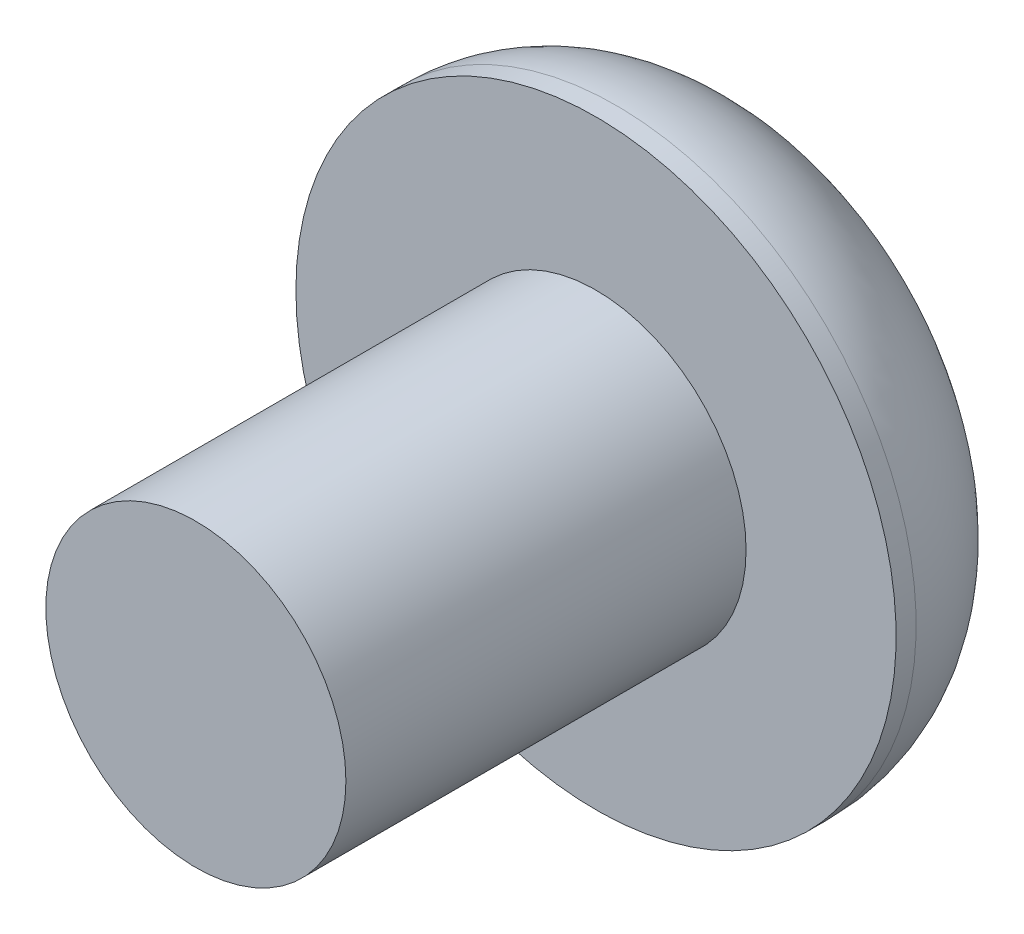
ISO-10303-21;
HEADER;
FILE_DESCRIPTION(('STEP AP214'),'2;1');
FILE_NAME('part.step','',(''),(''),'','','');
FILE_SCHEMA(('AUTOMOTIVE_DESIGN { 1 0 10303 214 1 1 1 1 }'));
ENDSEC;
DATA;
#1=APPLICATION_CONTEXT('core data for automotive mechanical design processes');
#2=APPLICATION_PROTOCOL_DEFINITION('international standard','automotive_design',2000,#1);
#3=PRODUCT_CONTEXT('',#1,'mechanical');
#4=PRODUCT('Part','Part','',(#3));
#5=PRODUCT_RELATED_PRODUCT_CATEGORY('part','',(#4));
#6=PRODUCT_DEFINITION_FORMATION('','',#4);
#7=PRODUCT_DEFINITION_CONTEXT('part definition',#1,'design');
#8=PRODUCT_DEFINITION('design','',#6,#7);
#9=PRODUCT_DEFINITION_SHAPE('','',#8);
#10=(LENGTH_UNIT() NAMED_UNIT(*) SI_UNIT(.MILLI.,.METRE.));
#11=(NAMED_UNIT(*) PLANE_ANGLE_UNIT() SI_UNIT($,.RADIAN.));
#12=(NAMED_UNIT(*) SI_UNIT($,.STERADIAN.) SOLID_ANGLE_UNIT());
#13=UNCERTAINTY_MEASURE_WITH_UNIT(LENGTH_MEASURE(1.E-05),#10,'distance_accuracy_value','');
#14=(GEOMETRIC_REPRESENTATION_CONTEXT(3) GLOBAL_UNCERTAINTY_ASSIGNED_CONTEXT((#13)) GLOBAL_UNIT_ASSIGNED_CONTEXT((#10,
#11,#12)) REPRESENTATION_CONTEXT('',''));
#15=CARTESIAN_POINT('',(0.,0.,0.));
#16=DIRECTION('',(0.,0.,1.));
#17=DIRECTION('',(1.,0.,0.));
#18=AXIS2_PLACEMENT_3D('',#15,#16,#17);
#19=CARTESIAN_POINT('',(0.,0.,4.));
#20=DIRECTION('',(0.,0.,-1.));
#21=DIRECTION('',(-1.,0.,0.));
#22=AXIS2_PLACEMENT_3D('',#19,#20,#21);
#23=CYLINDRICAL_SURFACE('',#22,1.5);
#24=CARTESIAN_POINT('',(0.,0.,4.));
#25=DIRECTION('',(0.,0.,1.));
#26=DIRECTION('',(1.,0.,0.));
#27=AXIS2_PLACEMENT_3D('',#24,#25,#26);
#28=CIRCLE('',#27,1.5);
#29=CARTESIAN_POINT('',(1.5,0.,4.));
#30=VERTEX_POINT('',#29);
#31=EDGE_CURVE('E52',#30,#30,#28,.T.);
#32=ORIENTED_EDGE('',*,*,#31,.F.);
#33=EDGE_LOOP('',(#32));
#34=FACE_BOUND('',#33,.T.);
#35=CARTESIAN_POINT('',(0.,0.,0.));
#36=DIRECTION('',(0.,0.,1.));
#37=DIRECTION('',(1.,0.,0.));
#38=AXIS2_PLACEMENT_3D('',#35,#36,#37);
#39=CIRCLE('',#38,1.5);
#40=CARTESIAN_POINT('',(1.5,0.,0.));
#41=VERTEX_POINT('',#40);
#42=EDGE_CURVE('E57',#41,#41,#39,.T.);
#43=ORIENTED_EDGE('',*,*,#42,.T.);
#44=EDGE_LOOP('',(#43));
#45=FACE_BOUND('',#44,.T.);
#46=ADVANCED_FACE('F39',(#34,#45),#23,.T.);
#47=CARTESIAN_POINT('',(0.,0.,4.));
#48=DIRECTION('',(0.,0.,1.));
#49=DIRECTION('',(1.,0.,0.));
#50=AXIS2_PLACEMENT_3D('',#47,#48,#49);
#51=PLANE('',#50);
#52=ORIENTED_EDGE('',*,*,#31,.T.);
#53=EDGE_LOOP('',(#52));
#54=FACE_BOUND('',#53,.T.);
#55=ADVANCED_FACE('F84',(#54),#51,.T.);
#56=CARTESIAN_POINT('',(0.,0.,-1.7));
#57=DIRECTION('',(0.,0.,1.));
#58=DIRECTION('',(1.,0.,0.));
#59=AXIS2_PLACEMENT_3D('',#56,#57,#58);
#60=CYLINDRICAL_SURFACE('',#59,3.);
#61=CARTESIAN_POINT('',(0.,0.,-0.2));
#62=DIRECTION('',(0.,0.,-1.));
#63=DIRECTION('',(-1.,0.,0.));
#64=AXIS2_PLACEMENT_3D('',#61,#62,#63);
#65=CIRCLE('',#64,3.);
#66=CARTESIAN_POINT('',(-3.,0.,-0.2));
#67=VERTEX_POINT('',#66);
#68=EDGE_CURVE('E10',#67,#67,#65,.F.);
#69=ORIENTED_EDGE('',*,*,#68,.T.);
#70=EDGE_LOOP('',(#69));
#71=FACE_BOUND('',#70,.T.);
#72=CARTESIAN_POINT('',(0.,0.,0.));
#73=DIRECTION('',(0.,0.,-1.));
#74=DIRECTION('',(-1.,0.,0.));
#75=AXIS2_PLACEMENT_3D('',#72,#73,#74);
#76=CIRCLE('',#75,3.);
#77=CARTESIAN_POINT('',(-3.,0.,0.));
#78=VERTEX_POINT('',#77);
#79=EDGE_CURVE('E62',#78,#78,#76,.T.);
#80=ORIENTED_EDGE('',*,*,#79,.T.);
#81=EDGE_LOOP('',(#80));
#82=FACE_BOUND('',#81,.T.);
#83=ADVANCED_FACE('F68',(#71,#82),#60,.T.);
#84=CARTESIAN_POINT('',(0.,0.,-1.7));
#85=DIRECTION('',(0.,0.,-1.));
#86=DIRECTION('',(-1.,0.,0.));
#87=AXIS2_PLACEMENT_3D('',#84,#85,#86);
#88=PLANE('',#87);
#89=CARTESIAN_POINT('',(0.,0.,-1.7));
#90=DIRECTION('',(0.,0.,-1.));
#91=DIRECTION('',(-1.,0.,0.));
#92=AXIS2_PLACEMENT_3D('',#89,#90,#91);
#93=CIRCLE('',#92,1.5);
#94=CARTESIAN_POINT('',(-1.5,0.,-1.7));
#95=VERTEX_POINT('',#94);
#96=EDGE_CURVE('E47',#95,#95,#93,.T.);
#97=ORIENTED_EDGE('',*,*,#96,.T.);
#98=EDGE_LOOP('',(#97));
#99=FACE_BOUND('',#98,.T.);
#100=ADVANCED_FACE('F72',(#99),#88,.T.);
#101=CARTESIAN_POINT('',(0.,0.,0.));
#102=DIRECTION('',(0.,0.,-1.));
#103=DIRECTION('',(-1.,0.,0.));
#104=AXIS2_PLACEMENT_3D('',#101,#102,#103);
#105=PLANE('',#104);
#106=ORIENTED_EDGE('',*,*,#42,.F.);
#107=EDGE_LOOP('',(#106));
#108=FACE_BOUND('',#107,.T.);
#109=ORIENTED_EDGE('',*,*,#79,.F.);
#110=EDGE_LOOP('',(#109));
#111=FACE_BOUND('',#110,.T.);
#112=ADVANCED_FACE('F70',(#108,#111),#105,.F.);
#113=CARTESIAN_POINT('',(0.,0.,-0.2));
#114=DIRECTION('',(0.,0.,-1.));
#115=DIRECTION('',(-1.,0.,0.));
#116=AXIS2_PLACEMENT_3D('',#113,#114,#115);
#117=TOROIDAL_SURFACE('',#116,1.5,1.5);
#118=ORIENTED_EDGE('',*,*,#68,.F.);
#119=EDGE_LOOP('',(#118));
#120=FACE_BOUND('',#119,.T.);
#121=ORIENTED_EDGE('',*,*,#96,.F.);
#122=EDGE_LOOP('',(#121));
#123=FACE_BOUND('',#122,.T.);
#124=ADVANCED_FACE('F41',(#120,#123),#117,.T.);
#125=CLOSED_SHELL('',(#46,#55,#83,#100,#112,#124));
#126=MANIFOLD_SOLID_BREP('B2',#125);
#127=ADVANCED_BREP_SHAPE_REPRESENTATION('',(#18,#126),#14);
#128=SHAPE_DEFINITION_REPRESENTATION(#9,#127);
ENDSEC;
END-ISO-10303-21;
